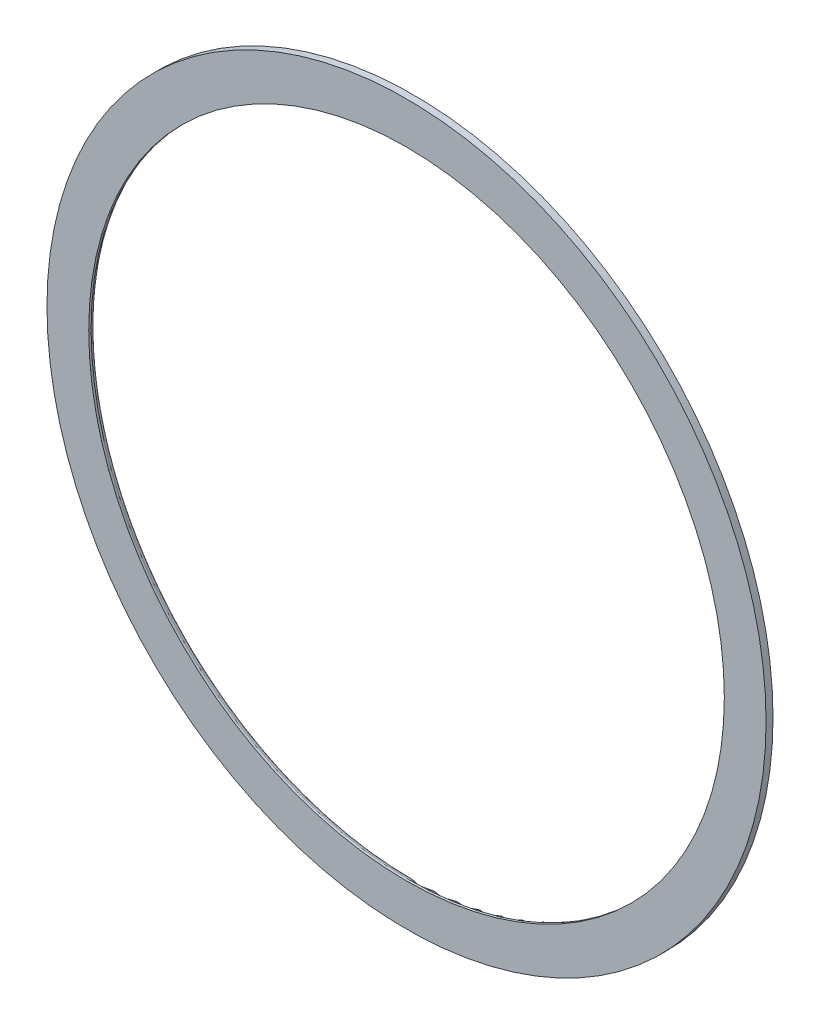
ISO-10303-21;
HEADER;
FILE_DESCRIPTION(('STEP AP214'),'2;1');
FILE_NAME('part.step','',(''),(''),'','','');
FILE_SCHEMA(('AUTOMOTIVE_DESIGN { 1 0 10303 214 1 1 1 1 }'));
ENDSEC;
DATA;
#1=APPLICATION_CONTEXT('core data for automotive mechanical design processes');
#2=APPLICATION_PROTOCOL_DEFINITION('international standard','automotive_design',2000,#1);
#3=PRODUCT_CONTEXT('',#1,'mechanical');
#4=PRODUCT('Part','Part','',(#3));
#5=PRODUCT_RELATED_PRODUCT_CATEGORY('part','',(#4));
#6=PRODUCT_DEFINITION_FORMATION('','',#4);
#7=PRODUCT_DEFINITION_CONTEXT('part definition',#1,'design');
#8=PRODUCT_DEFINITION('design','',#6,#7);
#9=PRODUCT_DEFINITION_SHAPE('','',#8);
#10=(LENGTH_UNIT() NAMED_UNIT(*) SI_UNIT(.MILLI.,.METRE.));
#11=(NAMED_UNIT(*) PLANE_ANGLE_UNIT() SI_UNIT($,.RADIAN.));
#12=(NAMED_UNIT(*) SI_UNIT($,.STERADIAN.) SOLID_ANGLE_UNIT());
#13=UNCERTAINTY_MEASURE_WITH_UNIT(LENGTH_MEASURE(1.E-05),#10,'distance_accuracy_value','');
#14=(GEOMETRIC_REPRESENTATION_CONTEXT(3) GLOBAL_UNCERTAINTY_ASSIGNED_CONTEXT((#13)) GLOBAL_UNIT_ASSIGNED_CONTEXT((#10,
#11,#12)) REPRESENTATION_CONTEXT('',''));
#15=CARTESIAN_POINT('',(0.,0.,0.));
#16=DIRECTION('',(0.,0.,1.));
#17=DIRECTION('',(1.,0.,0.));
#18=AXIS2_PLACEMENT_3D('',#15,#16,#17);
#19=CARTESIAN_POINT('',(0.,0.,1.5));
#20=DIRECTION('',(0.,0.,1.));
#21=DIRECTION('',(1.,0.,0.));
#22=AXIS2_PLACEMENT_3D('',#19,#20,#21);
#23=PLANE('',#22);
#24=CARTESIAN_POINT('',(0.,0.,1.5));
#25=DIRECTION('',(0.,0.,1.));
#26=DIRECTION('',(1.,0.,0.));
#27=AXIS2_PLACEMENT_3D('',#24,#25,#26);
#28=CIRCLE('',#27,77.5);
#29=CARTESIAN_POINT('',(77.5,0.,1.5));
#30=VERTEX_POINT('',#29);
#31=EDGE_CURVE('E56',#30,#30,#28,.T.);
#32=ORIENTED_EDGE('',*,*,#31,.T.);
#33=EDGE_LOOP('',(#32));
#34=FACE_BOUND('',#33,.T.);
#35=CARTESIAN_POINT('',(0.,0.,1.5));
#36=DIRECTION('',(0.,0.,1.));
#37=DIRECTION('',(1.,0.,0.));
#38=AXIS2_PLACEMENT_3D('',#35,#36,#37);
#39=CIRCLE('',#38,68.5);
#40=CARTESIAN_POINT('',(68.5,0.,1.5));
#41=VERTEX_POINT('',#40);
#42=EDGE_CURVE('E64',#41,#41,#39,.T.);
#43=ORIENTED_EDGE('',*,*,#42,.F.);
#44=EDGE_LOOP('',(#43));
#45=FACE_BOUND('',#44,.T.);
#46=ADVANCED_FACE('F45',(#34,#45),#23,.T.);
#47=CARTESIAN_POINT('',(0.,0.,0.));
#48=DIRECTION('',(0.,0.,1.));
#49=DIRECTION('',(1.,0.,0.));
#50=AXIS2_PLACEMENT_3D('',#47,#48,#49);
#51=PLANE('',#50);
#52=CARTESIAN_POINT('',(0.,0.,0.));
#53=DIRECTION('',(0.,0.,1.));
#54=DIRECTION('',(1.,0.,0.));
#55=AXIS2_PLACEMENT_3D('',#52,#53,#54);
#56=CIRCLE('',#55,69.5);
#57=CARTESIAN_POINT('',(69.5,0.,0.));
#58=VERTEX_POINT('',#57);
#59=EDGE_CURVE('E52',#58,#58,#56,.T.);
#60=ORIENTED_EDGE('',*,*,#59,.T.);
#61=EDGE_LOOP('',(#60));
#62=FACE_BOUND('',#61,.T.);
#63=CARTESIAN_POINT('',(0.,0.,0.));
#64=DIRECTION('',(0.,0.,1.));
#65=DIRECTION('',(1.,0.,0.));
#66=AXIS2_PLACEMENT_3D('',#63,#64,#65);
#67=CIRCLE('',#66,77.5);
#68=CARTESIAN_POINT('',(77.5,0.,0.));
#69=VERTEX_POINT('',#68);
#70=EDGE_CURVE('E60',#69,#69,#67,.T.);
#71=ORIENTED_EDGE('',*,*,#70,.F.);
#72=EDGE_LOOP('',(#71));
#73=FACE_BOUND('',#72,.T.);
#74=ADVANCED_FACE('F72',(#62,#73),#51,.F.);
#75=CARTESIAN_POINT('',(0.,0.,1.5));
#76=DIRECTION('',(0.,0.,-1.));
#77=DIRECTION('',(-1.,0.,0.));
#78=AXIS2_PLACEMENT_3D('',#75,#76,#77);
#79=CYLINDRICAL_SURFACE('',#78,77.5);
#80=ORIENTED_EDGE('',*,*,#31,.F.);
#81=EDGE_LOOP('',(#80));
#82=FACE_BOUND('',#81,.T.);
#83=ORIENTED_EDGE('',*,*,#70,.T.);
#84=EDGE_LOOP('',(#83));
#85=FACE_BOUND('',#84,.T.);
#86=ADVANCED_FACE('F79',(#82,#85),#79,.T.);
#87=CARTESIAN_POINT('',(0.,0.,1.5));
#88=DIRECTION('',(0.,0.,-1.));
#89=DIRECTION('',(-1.,0.,0.));
#90=AXIS2_PLACEMENT_3D('',#87,#88,#89);
#91=CYLINDRICAL_SURFACE('',#90,68.5);
#92=CARTESIAN_POINT('',(0.,0.,1.));
#93=DIRECTION('',(0.,0.,1.));
#94=DIRECTION('',(1.,0.,0.));
#95=AXIS2_PLACEMENT_3D('',#92,#93,#94);
#96=CIRCLE('',#95,68.5);
#97=CARTESIAN_POINT('',(68.5,0.,1.));
#98=VERTEX_POINT('',#97);
#99=EDGE_CURVE('E11',#98,#98,#96,.F.);
#100=ORIENTED_EDGE('',*,*,#99,.T.);
#101=EDGE_LOOP('',(#100));
#102=FACE_BOUND('',#101,.T.);
#103=ORIENTED_EDGE('',*,*,#42,.T.);
#104=EDGE_LOOP('',(#103));
#105=FACE_BOUND('',#104,.T.);
#106=ADVANCED_FACE('F69',(#102,#105),#91,.F.);
#107=CARTESIAN_POINT('',(0.,0.,1.));
#108=DIRECTION('',(0.,0.,1.));
#109=DIRECTION('',(1.,0.,0.));
#110=AXIS2_PLACEMENT_3D('',#107,#108,#109);
#111=TOROIDAL_SURFACE('',#110,69.5,1.);
#112=ORIENTED_EDGE('',*,*,#99,.F.);
#113=EDGE_LOOP('',(#112));
#114=FACE_BOUND('',#113,.T.);
#115=ORIENTED_EDGE('',*,*,#59,.F.);
#116=EDGE_LOOP('',(#115));
#117=FACE_BOUND('',#116,.T.);
#118=ADVANCED_FACE('F47',(#114,#117),#111,.T.);
#119=CLOSED_SHELL('',(#46,#74,#86,#106,#118));
#120=MANIFOLD_SOLID_BREP('B2',#119);
#121=ADVANCED_BREP_SHAPE_REPRESENTATION('',(#18,#120),#14);
#122=SHAPE_DEFINITION_REPRESENTATION(#9,#121);
ENDSEC;
END-ISO-10303-21;
